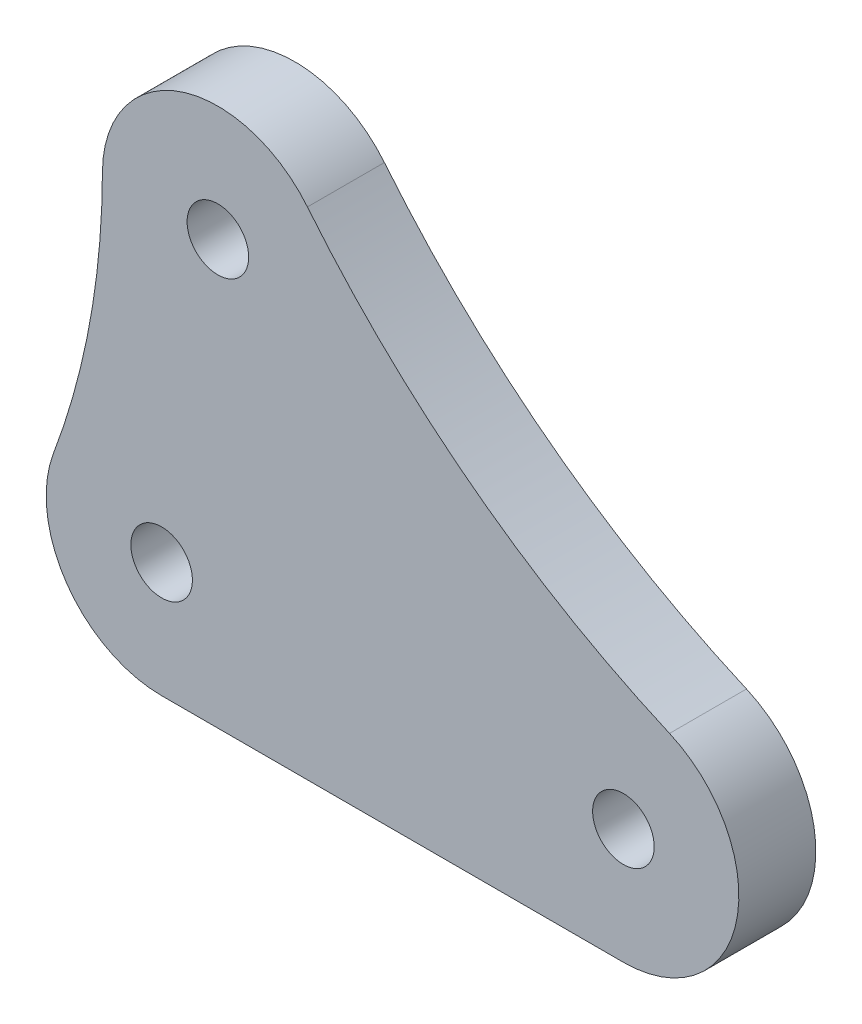
ISO-10303-21;
HEADER;
FILE_DESCRIPTION(('STEP AP214'),'2;1');
FILE_NAME('part.step','',(''),(''),'','','');
FILE_SCHEMA(('AUTOMOTIVE_DESIGN { 1 0 10303 214 1 1 1 1 }'));
ENDSEC;
DATA;
#1=APPLICATION_CONTEXT('core data for automotive mechanical design processes');
#2=APPLICATION_PROTOCOL_DEFINITION('international standard','automotive_design',2000,#1);
#3=PRODUCT_CONTEXT('',#1,'mechanical');
#4=PRODUCT('Part','Part','',(#3));
#5=PRODUCT_RELATED_PRODUCT_CATEGORY('part','',(#4));
#6=PRODUCT_DEFINITION_FORMATION('','',#4);
#7=PRODUCT_DEFINITION_CONTEXT('part definition',#1,'design');
#8=PRODUCT_DEFINITION('design','',#6,#7);
#9=PRODUCT_DEFINITION_SHAPE('','',#8);
#10=(LENGTH_UNIT() NAMED_UNIT(*) SI_UNIT(.MILLI.,.METRE.));
#11=(NAMED_UNIT(*) PLANE_ANGLE_UNIT() SI_UNIT($,.RADIAN.));
#12=(NAMED_UNIT(*) SI_UNIT($,.STERADIAN.) SOLID_ANGLE_UNIT());
#13=UNCERTAINTY_MEASURE_WITH_UNIT(LENGTH_MEASURE(1.E-05),#10,'distance_accuracy_value','');
#14=(GEOMETRIC_REPRESENTATION_CONTEXT(3) GLOBAL_UNCERTAINTY_ASSIGNED_CONTEXT((#13)) GLOBAL_UNIT_ASSIGNED_CONTEXT((#10,
#11,#12)) REPRESENTATION_CONTEXT('',''));
#15=CARTESIAN_POINT('',(0.,0.,0.));
#16=DIRECTION('',(0.,0.,1.));
#17=DIRECTION('',(1.,0.,0.));
#18=AXIS2_PLACEMENT_3D('',#15,#16,#17);
#19=CARTESIAN_POINT('',(0.,0.,5.));
#20=DIRECTION('',(0.,0.,1.));
#21=DIRECTION('',(1.,0.,0.));
#22=AXIS2_PLACEMENT_3D('',#19,#20,#21);
#23=PLANE('',#22);
#24=CARTESIAN_POINT('',(-30.,0.,5.));
#25=DIRECTION('',(0.,0.,1.));
#26=DIRECTION('',(1.,0.,0.));
#27=AXIS2_PLACEMENT_3D('',#24,#25,#26);
#28=CIRCLE('',#27,2.);
#29=CARTESIAN_POINT('',(-28.,0.,5.));
#30=VERTEX_POINT('',#29);
#31=EDGE_CURVE('E184',#30,#30,#28,.T.);
#32=ORIENTED_EDGE('',*,*,#31,.F.);
#33=EDGE_LOOP('',(#32));
#34=FACE_BOUND('',#33,.T.);
#35=CARTESIAN_POINT('',(0.,0.,5.));
#36=DIRECTION('',(0.,0.,1.));
#37=DIRECTION('',(1.,0.,0.));
#38=AXIS2_PLACEMENT_3D('',#35,#36,#37);
#39=CIRCLE('',#38,7.5);
#40=CARTESIAN_POINT('',(0.,-7.5,5.));
#41=VERTEX_POINT('',#40);
#42=CARTESIAN_POINT('',(2.99496599088239,6.87605837042255,5.));
#43=VERTEX_POINT('',#42);
#44=EDGE_CURVE('E128',#41,#43,#39,.T.);
#45=ORIENTED_EDGE('',*,*,#44,.T.);
#46=CARTESIAN_POINT('',(27.9530159149025,64.1765447906103,5.));
#47=DIRECTION('',(0.,0.,-1.));
#48=DIRECTION('',(1.,0.,0.));
#49=AXIS2_PLACEMENT_3D('',#46,#47,#48);
#50=CIRCLE('',#49,62.5);
#51=CARTESIAN_POINT('',(-20.5286574119083,24.7332012275654,5.));
#52=VERTEX_POINT('',#51);
#53=EDGE_CURVE('E86',#43,#52,#50,.T.);
#54=ORIENTED_EDGE('',*,*,#53,.T.);
#55=CARTESIAN_POINT('',(-26.3464582111256,20.,5.));
#56=DIRECTION('',(0.,0.,1.));
#57=DIRECTION('',(1.,0.,0.));
#58=AXIS2_PLACEMENT_3D('',#55,#56,#57);
#59=CIRCLE('',#58,7.5);
#60=CARTESIAN_POINT('',(-33.8464253637596,20.0221970586176,5.));
#61=VERTEX_POINT('',#60);
#62=EDGE_CURVE('E99',#52,#61,#59,.T.);
#63=ORIENTED_EDGE('',*,*,#62,.T.);
#64=CARTESIAN_POINT('',(-83.8462063813195,20.1701774494014,5.));
#65=DIRECTION('',(0.,0.,-1.));
#66=DIRECTION('',(1.,0.,0.));
#67=AXIS2_PLACEMENT_3D('',#64,#65,#66);
#68=CIRCLE('',#67,50.);
#69=CARTESIAN_POINT('',(-37.0234182236504,2.63089271079148,5.));
#70=VERTEX_POINT('',#69);
#71=EDGE_CURVE('E93',#61,#70,#68,.T.);
#72=ORIENTED_EDGE('',*,*,#71,.T.);
#73=CARTESIAN_POINT('',(-30.,0.,5.));
#74=DIRECTION('',(0.,0.,1.));
#75=DIRECTION('',(1.,0.,0.));
#76=AXIS2_PLACEMENT_3D('',#73,#74,#75);
#77=CIRCLE('',#76,7.49999999999999);
#78=CARTESIAN_POINT('',(-30.,-7.5,5.));
#79=VERTEX_POINT('',#78);
#80=EDGE_CURVE('E97',#70,#79,#77,.T.);
#81=ORIENTED_EDGE('',*,*,#80,.T.);
#82=DIRECTION('',(1.,0.,0.));
#83=VECTOR('',#82,1.);
#84=CARTESIAN_POINT('',(0.,-7.5,5.));
#85=LINE('',#84,#83);
#86=EDGE_CURVE('E49',#79,#41,#85,.T.);
#87=ORIENTED_EDGE('',*,*,#86,.T.);
#88=EDGE_LOOP('',(#45,#54,#63,#72,#81,#87));
#89=FACE_BOUND('',#88,.T.);
#90=CARTESIAN_POINT('',(0.,0.,5.));
#91=DIRECTION('',(0.,0.,1.));
#92=DIRECTION('',(1.,0.,0.));
#93=AXIS2_PLACEMENT_3D('',#90,#91,#92);
#94=CIRCLE('',#93,2.);
#95=CARTESIAN_POINT('',(2.,0.,5.));
#96=VERTEX_POINT('',#95);
#97=EDGE_CURVE('E121',#96,#96,#94,.T.);
#98=ORIENTED_EDGE('',*,*,#97,.F.);
#99=EDGE_LOOP('',(#98));
#100=FACE_BOUND('',#99,.T.);
#101=CARTESIAN_POINT('',(-26.3464582111256,20.,5.));
#102=DIRECTION('',(0.,0.,1.));
#103=DIRECTION('',(1.,0.,0.));
#104=AXIS2_PLACEMENT_3D('',#101,#102,#103);
#105=CIRCLE('',#104,2.);
#106=CARTESIAN_POINT('',(-24.3464582111256,20.,5.));
#107=VERTEX_POINT('',#106);
#108=EDGE_CURVE('E175',#107,#107,#105,.T.);
#109=ORIENTED_EDGE('',*,*,#108,.F.);
#110=EDGE_LOOP('',(#109));
#111=FACE_BOUND('',#110,.T.);
#112=ADVANCED_FACE('F32',(#34,#89,#100,#111),#23,.T.);
#113=CARTESIAN_POINT('',(0.,0.,0.));
#114=DIRECTION('',(0.,0.,1.));
#115=DIRECTION('',(1.,0.,0.));
#116=AXIS2_PLACEMENT_3D('',#113,#114,#115);
#117=PLANE('',#116);
#118=CARTESIAN_POINT('',(-30.,0.,0.));
#119=DIRECTION('',(0.,0.,1.));
#120=DIRECTION('',(1.,0.,0.));
#121=AXIS2_PLACEMENT_3D('',#118,#119,#120);
#122=CIRCLE('',#121,2.);
#123=CARTESIAN_POINT('',(-28.,0.,0.));
#124=VERTEX_POINT('',#123);
#125=EDGE_CURVE('E181',#124,#124,#122,.T.);
#126=ORIENTED_EDGE('',*,*,#125,.T.);
#127=EDGE_LOOP('',(#126));
#128=FACE_BOUND('',#127,.T.);
#129=CARTESIAN_POINT('',(0.,0.,0.));
#130=DIRECTION('',(0.,0.,1.));
#131=DIRECTION('',(1.,0.,0.));
#132=AXIS2_PLACEMENT_3D('',#129,#130,#131);
#133=CIRCLE('',#132,7.5);
#134=CARTESIAN_POINT('',(0.,-7.5,0.));
#135=VERTEX_POINT('',#134);
#136=CARTESIAN_POINT('',(2.99496599088239,6.87605837042255,0.));
#137=VERTEX_POINT('',#136);
#138=EDGE_CURVE('E117',#135,#137,#133,.T.);
#139=ORIENTED_EDGE('',*,*,#138,.F.);
#140=DIRECTION('',(1.,0.,0.));
#141=VECTOR('',#140,1.);
#142=CARTESIAN_POINT('',(0.,-7.5,0.));
#143=LINE('',#142,#141);
#144=CARTESIAN_POINT('',(-30.,-7.5,0.));
#145=VERTEX_POINT('',#144);
#146=EDGE_CURVE('E78',#145,#135,#143,.T.);
#147=ORIENTED_EDGE('',*,*,#146,.F.);
#148=CARTESIAN_POINT('',(-30.,0.,0.));
#149=DIRECTION('',(0.,0.,1.));
#150=DIRECTION('',(1.,0.,0.));
#151=AXIS2_PLACEMENT_3D('',#148,#149,#150);
#152=CIRCLE('',#151,7.49999999999999);
#153=CARTESIAN_POINT('',(-37.0234182236504,2.63089271079148,0.));
#154=VERTEX_POINT('',#153);
#155=EDGE_CURVE('E72',#154,#145,#152,.T.);
#156=ORIENTED_EDGE('',*,*,#155,.F.);
#157=CARTESIAN_POINT('',(-83.8462063813195,20.1701774494014,0.));
#158=DIRECTION('',(0.,0.,-1.));
#159=DIRECTION('',(1.,0.,0.));
#160=AXIS2_PLACEMENT_3D('',#157,#158,#159);
#161=CIRCLE('',#160,50.);
#162=CARTESIAN_POINT('',(-33.8464253637596,20.0221970586176,0.));
#163=VERTEX_POINT('',#162);
#164=EDGE_CURVE('E107',#163,#154,#161,.T.);
#165=ORIENTED_EDGE('',*,*,#164,.F.);
#166=CARTESIAN_POINT('',(-26.3464582111256,20.,0.));
#167=DIRECTION('',(0.,0.,1.));
#168=DIRECTION('',(1.,0.,0.));
#169=AXIS2_PLACEMENT_3D('',#166,#167,#168);
#170=CIRCLE('',#169,7.5);
#171=CARTESIAN_POINT('',(-20.5286574119083,24.7332012275654,0.));
#172=VERTEX_POINT('',#171);
#173=EDGE_CURVE('E123',#172,#163,#170,.T.);
#174=ORIENTED_EDGE('',*,*,#173,.F.);
#175=CARTESIAN_POINT('',(27.9530159149025,64.1765447906103,0.));
#176=DIRECTION('',(0.,0.,-1.));
#177=DIRECTION('',(1.,0.,0.));
#178=AXIS2_PLACEMENT_3D('',#175,#176,#177);
#179=CIRCLE('',#178,62.5);
#180=EDGE_CURVE('E120',#137,#172,#179,.T.);
#181=ORIENTED_EDGE('',*,*,#180,.F.);
#182=EDGE_LOOP('',(#139,#147,#156,#165,#174,#181));
#183=FACE_BOUND('',#182,.T.);
#184=CARTESIAN_POINT('',(0.,0.,0.));
#185=DIRECTION('',(0.,0.,1.));
#186=DIRECTION('',(1.,0.,0.));
#187=AXIS2_PLACEMENT_3D('',#184,#185,#186);
#188=CIRCLE('',#187,2.);
#189=CARTESIAN_POINT('',(2.,0.,0.));
#190=VERTEX_POINT('',#189);
#191=EDGE_CURVE('E187',#190,#190,#188,.T.);
#192=ORIENTED_EDGE('',*,*,#191,.T.);
#193=EDGE_LOOP('',(#192));
#194=FACE_BOUND('',#193,.T.);
#195=CARTESIAN_POINT('',(-26.3464582111256,20.,0.));
#196=DIRECTION('',(0.,0.,1.));
#197=DIRECTION('',(1.,0.,0.));
#198=AXIS2_PLACEMENT_3D('',#195,#196,#197);
#199=CIRCLE('',#198,2.);
#200=CARTESIAN_POINT('',(-24.3464582111256,20.,0.));
#201=VERTEX_POINT('',#200);
#202=EDGE_CURVE('E178',#201,#201,#199,.T.);
#203=ORIENTED_EDGE('',*,*,#202,.T.);
#204=EDGE_LOOP('',(#203));
#205=FACE_BOUND('',#204,.T.);
#206=ADVANCED_FACE('F137',(#128,#183,#194,#205),#117,.F.);
#207=CARTESIAN_POINT('',(0.,0.,5.));
#208=DIRECTION('',(0.,0.,-1.));
#209=DIRECTION('',(-1.,0.,0.));
#210=AXIS2_PLACEMENT_3D('',#207,#208,#209);
#211=CYLINDRICAL_SURFACE('',#210,7.5);
#212=ORIENTED_EDGE('',*,*,#138,.T.);
#213=DIRECTION('',(0.,0.,-1.));
#214=VECTOR('',#213,1.);
#215=CARTESIAN_POINT('',(2.99496599088239,6.87605837042255,5.));
#216=LINE('',#215,#214);
#217=EDGE_CURVE('E11',#43,#137,#216,.T.);
#218=ORIENTED_EDGE('',*,*,#217,.F.);
#219=ORIENTED_EDGE('',*,*,#44,.F.);
#220=DIRECTION('',(0.,0.,-1.));
#221=VECTOR('',#220,1.);
#222=CARTESIAN_POINT('',(0.,-7.5,5.));
#223=LINE('',#222,#221);
#224=EDGE_CURVE('E113',#41,#135,#223,.T.);
#225=ORIENTED_EDGE('',*,*,#224,.T.);
#226=EDGE_LOOP('',(#212,#218,#219,#225));
#227=FACE_BOUND('',#226,.T.);
#228=ADVANCED_FACE('F34',(#227),#211,.T.);
#229=CARTESIAN_POINT('',(27.9530159149025,64.1765447906103,5.));
#230=DIRECTION('',(0.,0.,-1.));
#231=DIRECTION('',(-1.,0.,0.));
#232=AXIS2_PLACEMENT_3D('',#229,#230,#231);
#233=CYLINDRICAL_SURFACE('',#232,62.5);
#234=ORIENTED_EDGE('',*,*,#180,.T.);
#235=DIRECTION('',(0.,0.,-1.));
#236=VECTOR('',#235,1.);
#237=CARTESIAN_POINT('',(-20.5286574119083,24.7332012275654,5.));
#238=LINE('',#237,#236);
#239=EDGE_CURVE('E41',#52,#172,#238,.T.);
#240=ORIENTED_EDGE('',*,*,#239,.F.);
#241=ORIENTED_EDGE('',*,*,#53,.F.);
#242=ORIENTED_EDGE('',*,*,#217,.T.);
#243=EDGE_LOOP('',(#234,#240,#241,#242));
#244=FACE_BOUND('',#243,.T.);
#245=ADVANCED_FACE('F236',(#244),#233,.F.);
#246=CARTESIAN_POINT('',(-26.3464582111256,20.,5.));
#247=DIRECTION('',(0.,0.,-1.));
#248=DIRECTION('',(-1.,0.,0.));
#249=AXIS2_PLACEMENT_3D('',#246,#247,#248);
#250=CYLINDRICAL_SURFACE('',#249,7.5);
#251=ORIENTED_EDGE('',*,*,#173,.T.);
#252=DIRECTION('',(0.,0.,-1.));
#253=VECTOR('',#252,1.);
#254=CARTESIAN_POINT('',(-33.8464253637596,20.0221970586176,5.));
#255=LINE('',#254,#253);
#256=EDGE_CURVE('E108',#61,#163,#255,.T.);
#257=ORIENTED_EDGE('',*,*,#256,.F.);
#258=ORIENTED_EDGE('',*,*,#62,.F.);
#259=ORIENTED_EDGE('',*,*,#239,.T.);
#260=EDGE_LOOP('',(#251,#257,#258,#259));
#261=FACE_BOUND('',#260,.T.);
#262=ADVANCED_FACE('F134',(#261),#250,.T.);
#263=CARTESIAN_POINT('',(-83.8462063813195,20.1701774494014,5.));
#264=DIRECTION('',(0.,0.,-1.));
#265=DIRECTION('',(-1.,0.,0.));
#266=AXIS2_PLACEMENT_3D('',#263,#264,#265);
#267=CYLINDRICAL_SURFACE('',#266,50.);
#268=ORIENTED_EDGE('',*,*,#164,.T.);
#269=DIRECTION('',(0.,0.,-1.));
#270=VECTOR('',#269,1.);
#271=CARTESIAN_POINT('',(-37.0234182236504,2.63089271079148,5.));
#272=LINE('',#271,#270);
#273=EDGE_CURVE('E104',#70,#154,#272,.T.);
#274=ORIENTED_EDGE('',*,*,#273,.F.);
#275=ORIENTED_EDGE('',*,*,#71,.F.);
#276=ORIENTED_EDGE('',*,*,#256,.T.);
#277=EDGE_LOOP('',(#268,#274,#275,#276));
#278=FACE_BOUND('',#277,.T.);
#279=ADVANCED_FACE('F105',(#278),#267,.F.);
#280=CARTESIAN_POINT('',(-30.,0.,5.));
#281=DIRECTION('',(0.,0.,-1.));
#282=DIRECTION('',(-1.,0.,0.));
#283=AXIS2_PLACEMENT_3D('',#280,#281,#282);
#284=CYLINDRICAL_SURFACE('',#283,7.49999999999999);
#285=ORIENTED_EDGE('',*,*,#155,.T.);
#286=DIRECTION('',(0.,0.,-1.));
#287=VECTOR('',#286,1.);
#288=CARTESIAN_POINT('',(-30.,-7.5,5.));
#289=LINE('',#288,#287);
#290=EDGE_CURVE('E109',#79,#145,#289,.T.);
#291=ORIENTED_EDGE('',*,*,#290,.F.);
#292=ORIENTED_EDGE('',*,*,#80,.F.);
#293=ORIENTED_EDGE('',*,*,#273,.T.);
#294=EDGE_LOOP('',(#285,#291,#292,#293));
#295=FACE_BOUND('',#294,.T.);
#296=ADVANCED_FACE('F111',(#295),#284,.T.);
#297=CARTESIAN_POINT('',(0.,-7.5,5.));
#298=DIRECTION('',(0.,1.,0.));
#299=DIRECTION('',(-1.,0.,0.));
#300=AXIS2_PLACEMENT_3D('',#297,#298,#299);
#301=PLANE('',#300);
#302=ORIENTED_EDGE('',*,*,#146,.T.);
#303=ORIENTED_EDGE('',*,*,#224,.F.);
#304=ORIENTED_EDGE('',*,*,#86,.F.);
#305=ORIENTED_EDGE('',*,*,#290,.T.);
#306=EDGE_LOOP('',(#302,#303,#304,#305));
#307=FACE_BOUND('',#306,.T.);
#308=ADVANCED_FACE('F142',(#307),#301,.F.);
#309=CARTESIAN_POINT('',(0.,0.,5.));
#310=DIRECTION('',(0.,0.,-1.));
#311=DIRECTION('',(-1.,0.,0.));
#312=AXIS2_PLACEMENT_3D('',#309,#310,#311);
#313=CYLINDRICAL_SURFACE('',#312,2.);
#314=ORIENTED_EDGE('',*,*,#97,.T.);
#315=EDGE_LOOP('',(#314));
#316=FACE_BOUND('',#315,.T.);
#317=ORIENTED_EDGE('',*,*,#191,.F.);
#318=EDGE_LOOP('',(#317));
#319=FACE_BOUND('',#318,.T.);
#320=ADVANCED_FACE('F144',(#316,#319),#313,.F.);
#321=CARTESIAN_POINT('',(-30.,0.,5.));
#322=DIRECTION('',(0.,0.,-1.));
#323=DIRECTION('',(-1.,0.,0.));
#324=AXIS2_PLACEMENT_3D('',#321,#322,#323);
#325=CYLINDRICAL_SURFACE('',#324,2.);
#326=ORIENTED_EDGE('',*,*,#31,.T.);
#327=EDGE_LOOP('',(#326));
#328=FACE_BOUND('',#327,.T.);
#329=ORIENTED_EDGE('',*,*,#125,.F.);
#330=EDGE_LOOP('',(#329));
#331=FACE_BOUND('',#330,.T.);
#332=ADVANCED_FACE('F150',(#328,#331),#325,.F.);
#333=CARTESIAN_POINT('',(-26.3464582111256,20.,5.));
#334=DIRECTION('',(0.,0.,-1.));
#335=DIRECTION('',(-1.,0.,0.));
#336=AXIS2_PLACEMENT_3D('',#333,#334,#335);
#337=CYLINDRICAL_SURFACE('',#336,2.);
#338=ORIENTED_EDGE('',*,*,#108,.T.);
#339=EDGE_LOOP('',(#338));
#340=FACE_BOUND('',#339,.T.);
#341=ORIENTED_EDGE('',*,*,#202,.F.);
#342=EDGE_LOOP('',(#341));
#343=FACE_BOUND('',#342,.T.);
#344=ADVANCED_FACE('F166',(#340,#343),#337,.F.);
#345=CLOSED_SHELL('',(#112,#206,#228,#245,#262,#279,#296,#308,#320,#332,#344));
#346=MANIFOLD_SOLID_BREP('B2',#345);
#347=ADVANCED_BREP_SHAPE_REPRESENTATION('',(#18,#346),#14);
#348=SHAPE_DEFINITION_REPRESENTATION(#9,#347);
ENDSEC;
END-ISO-10303-21;
